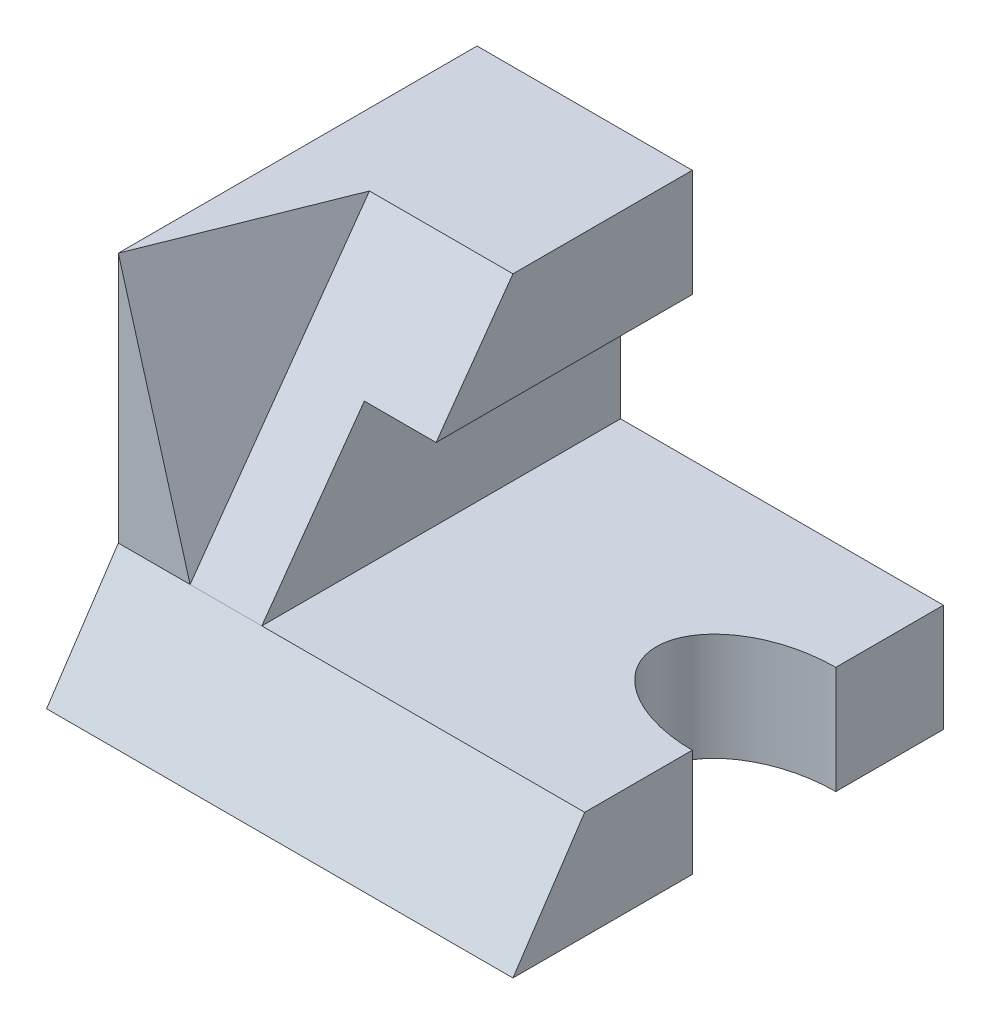
ISO-10303-21;
HEADER;
FILE_DESCRIPTION(('STEP AP214'),'2;1');
FILE_NAME('part.step','',(''),(''),'','','');
FILE_SCHEMA(('AUTOMOTIVE_DESIGN { 1 0 10303 214 1 1 1 1 }'));
ENDSEC;
DATA;
#1=APPLICATION_CONTEXT('core data for automotive mechanical design processes');
#2=APPLICATION_PROTOCOL_DEFINITION('international standard','automotive_design',2000,#1);
#3=PRODUCT_CONTEXT('',#1,'mechanical');
#4=PRODUCT('Part','Part','',(#3));
#5=PRODUCT_RELATED_PRODUCT_CATEGORY('part','',(#4));
#6=PRODUCT_DEFINITION_FORMATION('','',#4);
#7=PRODUCT_DEFINITION_CONTEXT('part definition',#1,'design');
#8=PRODUCT_DEFINITION('design','',#6,#7);
#9=PRODUCT_DEFINITION_SHAPE('','',#8);
#10=(LENGTH_UNIT() NAMED_UNIT(*) SI_UNIT(.MILLI.,.METRE.));
#11=(NAMED_UNIT(*) PLANE_ANGLE_UNIT() SI_UNIT($,.RADIAN.));
#12=(NAMED_UNIT(*) SI_UNIT($,.STERADIAN.) SOLID_ANGLE_UNIT());
#13=UNCERTAINTY_MEASURE_WITH_UNIT(LENGTH_MEASURE(1.E-05),#10,'distance_accuracy_value','');
#14=(GEOMETRIC_REPRESENTATION_CONTEXT(3) GLOBAL_UNCERTAINTY_ASSIGNED_CONTEXT((#13)) GLOBAL_UNIT_ASSIGNED_CONTEXT((#10,
#11,#12)) REPRESENTATION_CONTEXT('',''));
#15=CARTESIAN_POINT('',(0.,0.,0.));
#16=DIRECTION('',(0.,0.,1.));
#17=DIRECTION('',(1.,0.,0.));
#18=AXIS2_PLACEMENT_3D('',#15,#16,#17);
#19=CARTESIAN_POINT('',(65.,0.,0.));
#20=DIRECTION('',(1.,0.,0.));
#21=DIRECTION('',(0.,0.,-1.));
#22=AXIS2_PLACEMENT_3D('',#19,#20,#21);
#23=PLANE('',#22);
#24=DIRECTION('',(0.,1.,0.));
#25=VECTOR('',#24,1.);
#26=CARTESIAN_POINT('',(65.,-0.00100000000001002,15.));
#27=LINE('',#26,#25);
#28=CARTESIAN_POINT('',(65.,15.,15.));
#29=VERTEX_POINT('',#28);
#30=CARTESIAN_POINT('',(65.,0.,15.));
#31=VERTEX_POINT('',#30);
#32=EDGE_CURVE('E133',#29,#31,#27,.F.);
#33=ORIENTED_EDGE('',*,*,#32,.T.);
#34=DIRECTION('',(0.,0.,1.));
#35=VECTOR('',#34,1.);
#36=CARTESIAN_POINT('',(65.,0.,0.));
#37=LINE('',#36,#35);
#38=CARTESIAN_POINT('',(65.,0.,0.));
#39=VERTEX_POINT('',#38);
#40=EDGE_CURVE('E143',#39,#31,#37,.T.);
#41=ORIENTED_EDGE('',*,*,#40,.F.);
#42=DIRECTION('',(0.,1.,0.));
#43=VECTOR('',#42,1.);
#44=CARTESIAN_POINT('',(65.,0.,0.));
#45=LINE('',#44,#43);
#46=CARTESIAN_POINT('',(65.,15.,0.));
#47=VERTEX_POINT('',#46);
#48=EDGE_CURVE('E152',#39,#47,#45,.T.);
#49=ORIENTED_EDGE('',*,*,#48,.T.);
#50=DIRECTION('',(0.,0.,1.));
#51=VECTOR('',#50,1.);
#52=CARTESIAN_POINT('',(65.,15.,0.));
#53=LINE('',#52,#51);
#54=EDGE_CURVE('E145',#47,#29,#53,.T.);
#55=ORIENTED_EDGE('',*,*,#54,.T.);
#56=EDGE_LOOP('',(#33,#41,#49,#55));
#57=FACE_BOUND('',#56,.T.);
#58=ADVANCED_FACE('F45',(#57),#23,.T.);
#59=CARTESIAN_POINT('',(65.,27.6923076923077,41.5384615384615));
#60=DIRECTION('',(0.,0.554700196225229,0.832050294337844));
#61=DIRECTION('',(0.,-0.832050294337844,0.554700196225229));
#62=AXIS2_PLACEMENT_3D('',#59,#60,#61);
#63=PLANE('',#62);
#64=DIRECTION('',(0.,0.832050294337844,-0.554700196225229));
#65=VECTOR('',#64,1.);
#66=CARTESIAN_POINT('',(0.,27.6923076923077,41.5384615384615));
#67=LINE('',#66,#65);
#68=CARTESIAN_POINT('',(0.,0.,60.));
#69=VERTEX_POINT('',#68);
#70=CARTESIAN_POINT('',(0.,15.,50.));
#71=VERTEX_POINT('',#70);
#72=EDGE_CURVE('E166',#69,#71,#67,.T.);
#73=ORIENTED_EDGE('',*,*,#72,.F.);
#74=DIRECTION('',(-1.,0.,0.));
#75=VECTOR('',#74,1.);
#76=CARTESIAN_POINT('',(65.,0.,60.));
#77=LINE('',#76,#75);
#78=CARTESIAN_POINT('',(65.,0.,60.));
#79=VERTEX_POINT('',#78);
#80=EDGE_CURVE('E11',#79,#69,#77,.T.);
#81=ORIENTED_EDGE('',*,*,#80,.F.);
#82=DIRECTION('',(0.,0.832050294337844,-0.554700196225229));
#83=VECTOR('',#82,1.);
#84=CARTESIAN_POINT('',(65.,27.6923076923077,41.5384615384615));
#85=LINE('',#84,#83);
#86=CARTESIAN_POINT('',(65.,15.,50.));
#87=VERTEX_POINT('',#86);
#88=EDGE_CURVE('E159',#79,#87,#85,.T.);
#89=ORIENTED_EDGE('',*,*,#88,.T.);
#90=DIRECTION('',(-1.,0.,0.));
#91=VECTOR('',#90,1.);
#92=CARTESIAN_POINT('',(65.,15.,50.));
#93=LINE('',#92,#91);
#94=CARTESIAN_POINT('',(20.,15.,50.));
#95=VERTEX_POINT('',#94);
#96=EDGE_CURVE('E165',#87,#95,#93,.T.);
#97=ORIENTED_EDGE('',*,*,#96,.T.);
#98=DIRECTION('',(-1.,0.,0.));
#99=VECTOR('',#98,1.);
#100=CARTESIAN_POINT('',(20.,15.,50.));
#101=LINE('',#100,#99);
#102=CARTESIAN_POINT('',(10.,15.,50.));
#103=VERTEX_POINT('',#102);
#104=EDGE_CURVE('E171',#95,#103,#101,.T.);
#105=ORIENTED_EDGE('',*,*,#104,.T.);
#106=DIRECTION('',(-1.,0.,0.));
#107=VECTOR('',#106,1.);
#108=CARTESIAN_POINT('',(10.,15.,50.));
#109=LINE('',#108,#107);
#110=EDGE_CURVE('E204',#103,#71,#109,.T.);
#111=ORIENTED_EDGE('',*,*,#110,.T.);
#112=EDGE_LOOP('',(#73,#81,#89,#97,#105,#111));
#113=FACE_BOUND('',#112,.T.);
#114=ADVANCED_FACE('F47',(#113),#63,.T.);
#115=CARTESIAN_POINT('',(65.,0.,0.));
#116=DIRECTION('',(0.,-1.,0.));
#117=DIRECTION('',(0.,0.,-1.));
#118=AXIS2_PLACEMENT_3D('',#115,#116,#117);
#119=PLANE('',#118);
#120=CARTESIAN_POINT('',(65.,0.,25.));
#121=DIRECTION('',(0.,1.,0.));
#122=DIRECTION('',(1.,0.,0.));
#123=AXIS2_PLACEMENT_3D('',#120,#121,#122);
#124=ELLIPSE('',#123,15.,10.);
#125=CARTESIAN_POINT('',(65.,0.,35.));
#126=VERTEX_POINT('',#125);
#127=EDGE_CURVE('E130',#31,#126,#124,.T.);
#128=ORIENTED_EDGE('',*,*,#127,.T.);
#129=EDGE_CURVE('E153',#126,#79,#37,.T.);
#130=ORIENTED_EDGE('',*,*,#129,.T.);
#131=ORIENTED_EDGE('',*,*,#80,.T.);
#132=DIRECTION('',(0.,0.,1.));
#133=VECTOR('',#132,1.);
#134=CARTESIAN_POINT('',(0.,0.,0.));
#135=LINE('',#134,#133);
#136=CARTESIAN_POINT('',(0.,0.,0.));
#137=VERTEX_POINT('',#136);
#138=EDGE_CURVE('E170',#137,#69,#135,.T.);
#139=ORIENTED_EDGE('',*,*,#138,.F.);
#140=DIRECTION('',(-1.,0.,0.));
#141=VECTOR('',#140,1.);
#142=CARTESIAN_POINT('',(65.,0.,0.));
#143=LINE('',#142,#141);
#144=EDGE_CURVE('E54',#39,#137,#143,.T.);
#145=ORIENTED_EDGE('',*,*,#144,.F.);
#146=ORIENTED_EDGE('',*,*,#40,.T.);
#147=EDGE_LOOP('',(#128,#130,#131,#139,#145,#146));
#148=FACE_BOUND('',#147,.T.);
#149=ADVANCED_FACE('F148',(#148),#119,.T.);
#150=CARTESIAN_POINT('',(65.,0.,0.));
#151=DIRECTION('',(0.,0.,1.));
#152=DIRECTION('',(1.,0.,0.));
#153=AXIS2_PLACEMENT_3D('',#150,#151,#152);
#154=PLANE('',#153);
#155=DIRECTION('',(0.,1.,0.));
#156=VECTOR('',#155,1.);
#157=CARTESIAN_POINT('',(0.,0.,0.));
#158=LINE('',#157,#156);
#159=CARTESIAN_POINT('',(0.,50.,0.));
#160=VERTEX_POINT('',#159);
#161=EDGE_CURVE('E175',#137,#160,#158,.T.);
#162=ORIENTED_EDGE('',*,*,#161,.T.);
#163=DIRECTION('',(-1.,0.,0.));
#164=VECTOR('',#163,1.);
#165=CARTESIAN_POINT('',(30.,50.,0.));
#166=LINE('',#165,#164);
#167=CARTESIAN_POINT('',(30.,50.,0.));
#168=VERTEX_POINT('',#167);
#169=EDGE_CURVE('E243',#168,#160,#166,.T.);
#170=ORIENTED_EDGE('',*,*,#169,.F.);
#171=DIRECTION('',(0.,1.,0.));
#172=VECTOR('',#171,1.);
#173=CARTESIAN_POINT('',(30.,0.,0.));
#174=LINE('',#173,#172);
#175=CARTESIAN_POINT('',(30.,35.,0.));
#176=VERTEX_POINT('',#175);
#177=EDGE_CURVE('E225',#176,#168,#174,.T.);
#178=ORIENTED_EDGE('',*,*,#177,.F.);
#179=DIRECTION('',(-1.,0.,0.));
#180=VECTOR('',#179,1.);
#181=CARTESIAN_POINT('',(30.,35.,0.));
#182=LINE('',#181,#180);
#183=CARTESIAN_POINT('',(20.,35.,0.));
#184=VERTEX_POINT('',#183);
#185=EDGE_CURVE('E246',#176,#184,#182,.T.);
#186=ORIENTED_EDGE('',*,*,#185,.T.);
#187=DIRECTION('',(0.,1.,0.));
#188=VECTOR('',#187,1.);
#189=CARTESIAN_POINT('',(20.,0.,0.));
#190=LINE('',#189,#188);
#191=CARTESIAN_POINT('',(20.,15.,0.));
#192=VERTEX_POINT('',#191);
#193=EDGE_CURVE('E250',#192,#184,#190,.T.);
#194=ORIENTED_EDGE('',*,*,#193,.F.);
#195=DIRECTION('',(-1.,0.,0.));
#196=VECTOR('',#195,1.);
#197=CARTESIAN_POINT('',(65.,15.,0.));
#198=LINE('',#197,#196);
#199=EDGE_CURVE('E181',#47,#192,#198,.T.);
#200=ORIENTED_EDGE('',*,*,#199,.F.);
#201=ORIENTED_EDGE('',*,*,#48,.F.);
#202=ORIENTED_EDGE('',*,*,#144,.T.);
#203=EDGE_LOOP('',(#162,#170,#178,#186,#194,#200,#201,#202));
#204=FACE_BOUND('',#203,.T.);
#205=ADVANCED_FACE('F187',(#204),#154,.F.);
#206=CARTESIAN_POINT('',(65.,15.,0.));
#207=DIRECTION('',(0.,-1.,0.));
#208=DIRECTION('',(0.,0.,-1.));
#209=AXIS2_PLACEMENT_3D('',#206,#207,#208);
#210=PLANE('',#209);
#211=CARTESIAN_POINT('',(65.,15.,35.));
#212=VERTEX_POINT('',#211);
#213=EDGE_CURVE('E157',#212,#87,#53,.T.);
#214=ORIENTED_EDGE('',*,*,#213,.F.);
#215=CARTESIAN_POINT('',(65.,15.,25.));
#216=DIRECTION('',(0.,1.,0.));
#217=DIRECTION('',(1.,0.,0.));
#218=AXIS2_PLACEMENT_3D('',#215,#216,#217);
#219=ELLIPSE('',#218,15.,10.);
#220=EDGE_CURVE('E61',#29,#212,#219,.T.);
#221=ORIENTED_EDGE('',*,*,#220,.F.);
#222=ORIENTED_EDGE('',*,*,#54,.F.);
#223=ORIENTED_EDGE('',*,*,#199,.T.);
#224=DIRECTION('',(0.,0.,1.));
#225=VECTOR('',#224,1.);
#226=CARTESIAN_POINT('',(20.,15.,0.));
#227=LINE('',#226,#225);
#228=EDGE_CURVE('E262',#192,#95,#227,.T.);
#229=ORIENTED_EDGE('',*,*,#228,.T.);
#230=ORIENTED_EDGE('',*,*,#96,.F.);
#231=EDGE_LOOP('',(#214,#221,#222,#223,#229,#230));
#232=FACE_BOUND('',#231,.T.);
#233=ADVANCED_FACE('F273',(#232),#210,.F.);
#234=DIRECTION('',(0.,1.,0.));
#235=VECTOR('',#234,1.);
#236=CARTESIAN_POINT('',(65.,-0.0010000000000128,35.));
#237=LINE('',#236,#235);
#238=EDGE_CURVE('E134',#126,#212,#237,.T.);
#239=ORIENTED_EDGE('',*,*,#238,.T.);
#240=ORIENTED_EDGE('',*,*,#213,.T.);
#241=ORIENTED_EDGE('',*,*,#88,.F.);
#242=ORIENTED_EDGE('',*,*,#129,.F.);
#243=EDGE_LOOP('',(#239,#240,#241,#242));
#244=FACE_BOUND('',#243,.T.);
#245=ADVANCED_FACE('F298',(#244),#23,.T.);
#246=CARTESIAN_POINT('',(0.,0.,0.));
#247=DIRECTION('',(1.,0.,0.));
#248=DIRECTION('',(0.,0.,-1.));
#249=AXIS2_PLACEMENT_3D('',#246,#247,#248);
#250=PLANE('',#249);
#251=ORIENTED_EDGE('',*,*,#72,.T.);
#252=DIRECTION('',(0.,-1.,0.));
#253=VECTOR('',#252,1.);
#254=CARTESIAN_POINT('',(0.,0.,50.));
#255=LINE('',#254,#253);
#256=CARTESIAN_POINT('',(0.,50.,50.));
#257=VERTEX_POINT('',#256);
#258=EDGE_CURVE('E206',#257,#71,#255,.T.);
#259=ORIENTED_EDGE('',*,*,#258,.F.);
#260=DIRECTION('',(0.,0.,1.));
#261=VECTOR('',#260,1.);
#262=CARTESIAN_POINT('',(0.,50.,0.));
#263=LINE('',#262,#261);
#264=EDGE_CURVE('E196',#160,#257,#263,.T.);
#265=ORIENTED_EDGE('',*,*,#264,.F.);
#266=ORIENTED_EDGE('',*,*,#161,.F.);
#267=ORIENTED_EDGE('',*,*,#138,.T.);
#268=EDGE_LOOP('',(#251,#259,#265,#266,#267));
#269=FACE_BOUND('',#268,.T.);
#270=ADVANCED_FACE('F193',(#269),#250,.F.);
#271=CARTESIAN_POINT('',(20.,28.7162162162162,40.2027027027027));
#272=DIRECTION('',(0.,0.581238193719096,0.813733471206735));
#273=DIRECTION('',(0.,-0.813733471206735,0.581238193719096));
#274=AXIS2_PLACEMENT_3D('',#271,#272,#273);
#275=PLANE('',#274);
#276=DIRECTION('',(0.,0.813733471206735,-0.581238193719096));
#277=VECTOR('',#276,1.);
#278=CARTESIAN_POINT('',(20.,28.7162162162162,40.2027027027027));
#279=LINE('',#278,#277);
#280=CARTESIAN_POINT('',(20.,35.,35.7142857142857));
#281=VERTEX_POINT('',#280);
#282=EDGE_CURVE('E258',#95,#281,#279,.T.);
#283=ORIENTED_EDGE('',*,*,#282,.T.);
#284=DIRECTION('',(-1.,0.,0.));
#285=VECTOR('',#284,1.);
#286=CARTESIAN_POINT('',(30.,35.,35.7142857142857));
#287=LINE('',#286,#285);
#288=CARTESIAN_POINT('',(30.,35.,35.7142857142857));
#289=VERTEX_POINT('',#288);
#290=EDGE_CURVE('E235',#289,#281,#287,.T.);
#291=ORIENTED_EDGE('',*,*,#290,.F.);
#292=DIRECTION('',(0.,0.813733471206735,-0.581238193719096));
#293=VECTOR('',#292,1.);
#294=CARTESIAN_POINT('',(30.,28.7162162162162,40.2027027027027));
#295=LINE('',#294,#293);
#296=CARTESIAN_POINT('',(30.,50.,25.));
#297=VERTEX_POINT('',#296);
#298=EDGE_CURVE('E231',#289,#297,#295,.T.);
#299=ORIENTED_EDGE('',*,*,#298,.T.);
#300=DIRECTION('',(-1.,0.,0.));
#301=VECTOR('',#300,1.);
#302=CARTESIAN_POINT('',(30.,50.,25.));
#303=LINE('',#302,#301);
#304=CARTESIAN_POINT('',(9.99999999999998,50.,25.));
#305=VERTEX_POINT('',#304);
#306=EDGE_CURVE('E240',#297,#305,#303,.T.);
#307=ORIENTED_EDGE('',*,*,#306,.T.);
#308=DIRECTION('',(0.,0.813733471206735,-0.581238193719096));
#309=VECTOR('',#308,1.);
#310=CARTESIAN_POINT('',(10.,28.7162162162162,40.2027027027027));
#311=LINE('',#310,#309);
#312=EDGE_CURVE('E210',#103,#305,#311,.T.);
#313=ORIENTED_EDGE('',*,*,#312,.F.);
#314=ORIENTED_EDGE('',*,*,#104,.F.);
#315=EDGE_LOOP('',(#283,#291,#299,#307,#313,#314));
#316=FACE_BOUND('',#315,.T.);
#317=ADVANCED_FACE('F269',(#316),#275,.T.);
#318=CARTESIAN_POINT('',(20.,0.,0.));
#319=DIRECTION('',(1.,0.,0.));
#320=DIRECTION('',(0.,0.,-1.));
#321=AXIS2_PLACEMENT_3D('',#318,#319,#320);
#322=PLANE('',#321);
#323=ORIENTED_EDGE('',*,*,#193,.T.);
#324=DIRECTION('',(0.,0.,1.));
#325=VECTOR('',#324,1.);
#326=CARTESIAN_POINT('',(20.,35.,0.));
#327=LINE('',#326,#325);
#328=EDGE_CURVE('E254',#184,#281,#327,.T.);
#329=ORIENTED_EDGE('',*,*,#328,.T.);
#330=ORIENTED_EDGE('',*,*,#282,.F.);
#331=ORIENTED_EDGE('',*,*,#228,.F.);
#332=EDGE_LOOP('',(#323,#329,#330,#331));
#333=FACE_BOUND('',#332,.T.);
#334=ADVANCED_FACE('F275',(#333),#322,.T.);
#335=CARTESIAN_POINT('',(30.,35.,0.));
#336=DIRECTION('',(0.,-1.,0.));
#337=DIRECTION('',(0.,0.,-1.));
#338=AXIS2_PLACEMENT_3D('',#335,#336,#337);
#339=PLANE('',#338);
#340=ORIENTED_EDGE('',*,*,#328,.F.);
#341=ORIENTED_EDGE('',*,*,#185,.F.);
#342=DIRECTION('',(0.,0.,1.));
#343=VECTOR('',#342,1.);
#344=CARTESIAN_POINT('',(30.,35.,0.));
#345=LINE('',#344,#343);
#346=EDGE_CURVE('E221',#176,#289,#345,.T.);
#347=ORIENTED_EDGE('',*,*,#346,.T.);
#348=ORIENTED_EDGE('',*,*,#290,.T.);
#349=EDGE_LOOP('',(#340,#341,#347,#348));
#350=FACE_BOUND('',#349,.T.);
#351=ADVANCED_FACE('F277',(#350),#339,.T.);
#352=CARTESIAN_POINT('',(30.,50.,0.));
#353=DIRECTION('',(0.,-1.,0.));
#354=DIRECTION('',(0.,0.,-1.));
#355=AXIS2_PLACEMENT_3D('',#352,#353,#354);
#356=PLANE('',#355);
#357=ORIENTED_EDGE('',*,*,#264,.T.);
#358=DIRECTION('',(0.371390676354104,0.,-0.928476690885259));
#359=VECTOR('',#358,1.);
#360=CARTESIAN_POINT('',(0.,50.,50.));
#361=LINE('',#360,#359);
#362=EDGE_CURVE('E211',#257,#305,#361,.T.);
#363=ORIENTED_EDGE('',*,*,#362,.T.);
#364=ORIENTED_EDGE('',*,*,#306,.F.);
#365=DIRECTION('',(0.,0.,1.));
#366=VECTOR('',#365,1.);
#367=CARTESIAN_POINT('',(30.,50.,0.));
#368=LINE('',#367,#366);
#369=EDGE_CURVE('E228',#168,#297,#368,.T.);
#370=ORIENTED_EDGE('',*,*,#369,.F.);
#371=ORIENTED_EDGE('',*,*,#169,.T.);
#372=EDGE_LOOP('',(#357,#363,#364,#370,#371));
#373=FACE_BOUND('',#372,.T.);
#374=ADVANCED_FACE('F287',(#373),#356,.F.);
#375=CARTESIAN_POINT('',(30.,0.,0.));
#376=DIRECTION('',(1.,0.,0.));
#377=DIRECTION('',(0.,0.,-1.));
#378=AXIS2_PLACEMENT_3D('',#375,#376,#377);
#379=PLANE('',#378);
#380=ORIENTED_EDGE('',*,*,#346,.F.);
#381=ORIENTED_EDGE('',*,*,#177,.T.);
#382=ORIENTED_EDGE('',*,*,#369,.T.);
#383=ORIENTED_EDGE('',*,*,#298,.F.);
#384=EDGE_LOOP('',(#380,#381,#382,#383));
#385=FACE_BOUND('',#384,.T.);
#386=ADVANCED_FACE('F283',(#385),#379,.T.);
#387=CARTESIAN_POINT('',(10.,0.,50.));
#388=DIRECTION('',(0.,0.,-1.));
#389=DIRECTION('',(-1.,0.,0.));
#390=AXIS2_PLACEMENT_3D('',#387,#388,#389);
#391=PLANE('',#390);
#392=ORIENTED_EDGE('',*,*,#110,.F.);
#393=DIRECTION('',(-0.274721127897378,0.961523947640823,0.));
#394=VECTOR('',#393,1.);
#395=CARTESIAN_POINT('',(9.99999999999999,15.,50.));
#396=LINE('',#395,#394);
#397=EDGE_CURVE('E69',#103,#257,#396,.T.);
#398=ORIENTED_EDGE('',*,*,#397,.T.);
#399=ORIENTED_EDGE('',*,*,#258,.T.);
#400=EDGE_LOOP('',(#392,#398,#399));
#401=FACE_BOUND('',#400,.T.);
#402=ADVANCED_FACE('F208',(#401),#391,.F.);
#403=CARTESIAN_POINT('',(27.6134122287968,7.88954635108482,11.0453648915187));
#404=DIRECTION('',(-0.897435897435897,-0.256410256410257,-0.358974358974359));
#405=DIRECTION('',(-0.371390676354104,0.,0.928476690885259));
#406=AXIS2_PLACEMENT_3D('',#403,#404,#405);
#407=PLANE('',#406);
#408=ORIENTED_EDGE('',*,*,#397,.F.);
#409=ORIENTED_EDGE('',*,*,#312,.T.);
#410=ORIENTED_EDGE('',*,*,#362,.F.);
#411=EDGE_LOOP('',(#408,#409,#410));
#412=FACE_BOUND('',#411,.T.);
#413=ADVANCED_FACE('F286',(#412),#407,.F.);
#414=CARTESIAN_POINT('',(65.,-0.00100000000001141,25.));
#415=DIRECTION('',(0.,1.,0.));
#416=DIRECTION('',(1.,0.,0.));
#417=AXIS2_PLACEMENT_3D('',#414,#415,#416);
#418=ELLIPSE('',#417,15.,10.);
#419=DIRECTION('',(0.,1.,0.));
#420=VECTOR('',#419,1.);
#421=SURFACE_OF_LINEAR_EXTRUSION('',#418,#420);
#422=ORIENTED_EDGE('',*,*,#220,.T.);
#423=ORIENTED_EDGE('',*,*,#238,.F.);
#424=ORIENTED_EDGE('',*,*,#127,.F.);
#425=ORIENTED_EDGE('',*,*,#32,.F.);
#426=EDGE_LOOP('',(#422,#423,#424,#425));
#427=FACE_BOUND('',#426,.T.);
#428=ADVANCED_FACE('F132',(#427),#421,.F.);
#429=CLOSED_SHELL('',(#58,#114,#149,#205,#233,#245,#270,#317,#334,#351,#374,#386,#402,#413,#428));
#430=MANIFOLD_SOLID_BREP('B2',#429);
#431=ADVANCED_BREP_SHAPE_REPRESENTATION('',(#18,#430),#14);
#432=SHAPE_DEFINITION_REPRESENTATION(#9,#431);
ENDSEC;
END-ISO-10303-21;
